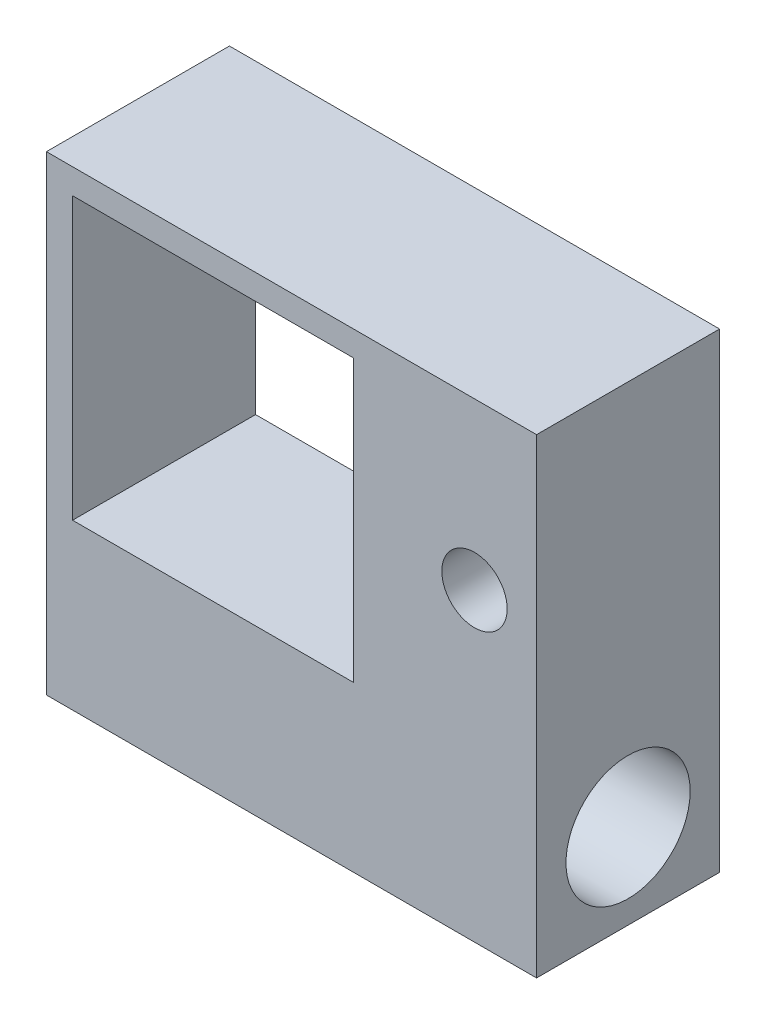
ISO-10303-21;
HEADER;
FILE_DESCRIPTION(('STEP AP214'),'2;1');
FILE_NAME('part.step','',(''),(''),'','','');
FILE_SCHEMA(('AUTOMOTIVE_DESIGN { 1 0 10303 214 1 1 1 1 }'));
ENDSEC;
DATA;
#1=APPLICATION_CONTEXT('core data for automotive mechanical design processes');
#2=APPLICATION_PROTOCOL_DEFINITION('international standard','automotive_design',2000,#1);
#3=PRODUCT_CONTEXT('',#1,'mechanical');
#4=PRODUCT('Part','Part','',(#3));
#5=PRODUCT_RELATED_PRODUCT_CATEGORY('part','',(#4));
#6=PRODUCT_DEFINITION_FORMATION('','',#4);
#7=PRODUCT_DEFINITION_CONTEXT('part definition',#1,'design');
#8=PRODUCT_DEFINITION('design','',#6,#7);
#9=PRODUCT_DEFINITION_SHAPE('','',#8);
#10=(LENGTH_UNIT() NAMED_UNIT(*) SI_UNIT(.MILLI.,.METRE.));
#11=(NAMED_UNIT(*) PLANE_ANGLE_UNIT() SI_UNIT($,.RADIAN.));
#12=(NAMED_UNIT(*) SI_UNIT($,.STERADIAN.) SOLID_ANGLE_UNIT());
#13=UNCERTAINTY_MEASURE_WITH_UNIT(LENGTH_MEASURE(1.E-05),#10,'distance_accuracy_value','');
#14=(GEOMETRIC_REPRESENTATION_CONTEXT(3) GLOBAL_UNCERTAINTY_ASSIGNED_CONTEXT((#13)) GLOBAL_UNIT_ASSIGNED_CONTEXT((#10,
#11,#12)) REPRESENTATION_CONTEXT('',''));
#15=CARTESIAN_POINT('',(0.,0.,0.));
#16=DIRECTION('',(0.,0.,1.));
#17=DIRECTION('',(1.,0.,0.));
#18=AXIS2_PLACEMENT_3D('',#15,#16,#17);
#19=CARTESIAN_POINT('',(0.,0.,28.));
#20=DIRECTION('',(0.,0.,-1.));
#21=DIRECTION('',(-1.,0.,0.));
#22=AXIS2_PLACEMENT_3D('',#19,#20,#21);
#23=PLANE('',#22);
#24=DIRECTION('',(0.,1.,0.));
#25=VECTOR('',#24,1.);
#26=CARTESIAN_POINT('',(37.5,-36.,28.));
#27=LINE('',#26,#25);
#28=CARTESIAN_POINT('',(37.5,-36.,28.));
#29=VERTEX_POINT('',#28);
#30=CARTESIAN_POINT('',(37.5,36.,28.));
#31=VERTEX_POINT('',#30);
#32=EDGE_CURVE('E156',#29,#31,#27,.T.);
#33=ORIENTED_EDGE('',*,*,#32,.T.);
#34=DIRECTION('',(-1.,0.,0.));
#35=VECTOR('',#34,1.);
#36=CARTESIAN_POINT('',(-37.5,36.,28.));
#37=LINE('',#36,#35);
#38=CARTESIAN_POINT('',(-37.5,36.,28.));
#39=VERTEX_POINT('',#38);
#40=EDGE_CURVE('E160',#31,#39,#37,.T.);
#41=ORIENTED_EDGE('',*,*,#40,.T.);
#42=DIRECTION('',(0.,-1.,0.));
#43=VECTOR('',#42,1.);
#44=CARTESIAN_POINT('',(-37.5,-36.,28.));
#45=LINE('',#44,#43);
#46=CARTESIAN_POINT('',(-37.5,-36.,28.));
#47=VERTEX_POINT('',#46);
#48=EDGE_CURVE('E164',#39,#47,#45,.T.);
#49=ORIENTED_EDGE('',*,*,#48,.T.);
#50=DIRECTION('',(1.,0.,0.));
#51=VECTOR('',#50,1.);
#52=CARTESIAN_POINT('',(-37.5,-36.,28.));
#53=LINE('',#52,#51);
#54=EDGE_CURVE('E167',#47,#29,#53,.T.);
#55=ORIENTED_EDGE('',*,*,#54,.T.);
#56=EDGE_LOOP('',(#33,#41,#49,#55));
#57=FACE_BOUND('',#56,.T.);
#58=DIRECTION('',(0.,-1.,0.));
#59=VECTOR('',#58,1.);
#60=CARTESIAN_POINT('',(-33.5,32.16,28.));
#61=LINE('',#60,#59);
#62=CARTESIAN_POINT('',(-33.5,32.16,28.));
#63=VERTEX_POINT('',#62);
#64=CARTESIAN_POINT('',(-33.5,-10.84,28.));
#65=VERTEX_POINT('',#64);
#66=EDGE_CURVE('E105',#63,#65,#61,.T.);
#67=ORIENTED_EDGE('',*,*,#66,.F.);
#68=DIRECTION('',(-1.,0.,0.));
#69=VECTOR('',#68,1.);
#70=CARTESIAN_POINT('',(-33.5,32.16,28.));
#71=LINE('',#70,#69);
#72=CARTESIAN_POINT('',(9.49999999999998,32.16,28.));
#73=VERTEX_POINT('',#72);
#74=EDGE_CURVE('E132',#73,#63,#71,.T.);
#75=ORIENTED_EDGE('',*,*,#74,.F.);
#76=DIRECTION('',(0.,1.,0.));
#77=VECTOR('',#76,1.);
#78=CARTESIAN_POINT('',(9.49999999999998,32.16,28.));
#79=LINE('',#78,#77);
#80=CARTESIAN_POINT('',(9.49999999999999,-10.84,28.));
#81=VERTEX_POINT('',#80);
#82=EDGE_CURVE('E128',#81,#73,#79,.T.);
#83=ORIENTED_EDGE('',*,*,#82,.F.);
#84=DIRECTION('',(1.,0.,0.));
#85=VECTOR('',#84,1.);
#86=CARTESIAN_POINT('',(-33.5,-10.84,28.));
#87=LINE('',#86,#85);
#88=EDGE_CURVE('E114',#65,#81,#87,.T.);
#89=ORIENTED_EDGE('',*,*,#88,.F.);
#90=EDGE_LOOP('',(#67,#75,#83,#89));
#91=FACE_BOUND('',#90,.T.);
#92=CARTESIAN_POINT('',(28.,10.66,28.));
#93=DIRECTION('',(0.,0.,1.));
#94=DIRECTION('',(1.,0.,0.));
#95=AXIS2_PLACEMENT_3D('',#92,#93,#94);
#96=CIRCLE('',#95,5.00000000000001);
#97=CARTESIAN_POINT('',(33.,10.66,28.));
#98=VERTEX_POINT('',#97);
#99=EDGE_CURVE('E140',#98,#98,#96,.T.);
#100=ORIENTED_EDGE('',*,*,#99,.F.);
#101=EDGE_LOOP('',(#100));
#102=FACE_BOUND('',#101,.T.);
#103=ADVANCED_FACE('F39',(#57,#91,#102),#23,.F.);
#104=CARTESIAN_POINT('',(0.,0.,0.));
#105=DIRECTION('',(0.,0.,-1.));
#106=DIRECTION('',(-1.,0.,0.));
#107=AXIS2_PLACEMENT_3D('',#104,#105,#106);
#108=PLANE('',#107);
#109=DIRECTION('',(-1.,0.,0.));
#110=VECTOR('',#109,1.);
#111=CARTESIAN_POINT('',(-33.5,32.16,0.));
#112=LINE('',#111,#110);
#113=CARTESIAN_POINT('',(9.49999999999998,32.16,0.));
#114=VERTEX_POINT('',#113);
#115=CARTESIAN_POINT('',(-33.5,32.16,0.));
#116=VERTEX_POINT('',#115);
#117=EDGE_CURVE('E115',#114,#116,#112,.T.);
#118=ORIENTED_EDGE('',*,*,#117,.T.);
#119=DIRECTION('',(0.,-1.,0.));
#120=VECTOR('',#119,1.);
#121=CARTESIAN_POINT('',(-33.5,32.16,0.));
#122=LINE('',#121,#120);
#123=CARTESIAN_POINT('',(-33.5,-10.84,0.));
#124=VERTEX_POINT('',#123);
#125=EDGE_CURVE('E63',#116,#124,#122,.T.);
#126=ORIENTED_EDGE('',*,*,#125,.T.);
#127=DIRECTION('',(1.,0.,0.));
#128=VECTOR('',#127,1.);
#129=CARTESIAN_POINT('',(-33.5,-10.84,0.));
#130=LINE('',#129,#128);
#131=CARTESIAN_POINT('',(9.49999999999999,-10.84,0.));
#132=VERTEX_POINT('',#131);
#133=EDGE_CURVE('E121',#124,#132,#130,.T.);
#134=ORIENTED_EDGE('',*,*,#133,.T.);
#135=DIRECTION('',(0.,1.,0.));
#136=VECTOR('',#135,1.);
#137=CARTESIAN_POINT('',(9.49999999999998,32.16,0.));
#138=LINE('',#137,#136);
#139=EDGE_CURVE('E143',#132,#114,#138,.T.);
#140=ORIENTED_EDGE('',*,*,#139,.T.);
#141=EDGE_LOOP('',(#118,#126,#134,#140));
#142=FACE_BOUND('',#141,.T.);
#143=DIRECTION('',(0.,1.,0.));
#144=VECTOR('',#143,1.);
#145=CARTESIAN_POINT('',(37.5,-36.,0.));
#146=LINE('',#145,#144);
#147=CARTESIAN_POINT('',(37.5,-36.,0.));
#148=VERTEX_POINT('',#147);
#149=CARTESIAN_POINT('',(37.5,36.,0.));
#150=VERTEX_POINT('',#149);
#151=EDGE_CURVE('E123',#148,#150,#146,.T.);
#152=ORIENTED_EDGE('',*,*,#151,.F.);
#153=DIRECTION('',(1.,0.,0.));
#154=VECTOR('',#153,1.);
#155=CARTESIAN_POINT('',(-37.5,-36.,0.));
#156=LINE('',#155,#154);
#157=CARTESIAN_POINT('',(-37.5,-36.,0.));
#158=VERTEX_POINT('',#157);
#159=EDGE_CURVE('E161',#158,#148,#156,.T.);
#160=ORIENTED_EDGE('',*,*,#159,.F.);
#161=DIRECTION('',(0.,-1.,0.));
#162=VECTOR('',#161,1.);
#163=CARTESIAN_POINT('',(-37.5,-36.,0.));
#164=LINE('',#163,#162);
#165=CARTESIAN_POINT('',(-37.5,36.,0.));
#166=VERTEX_POINT('',#165);
#167=EDGE_CURVE('E177',#166,#158,#164,.T.);
#168=ORIENTED_EDGE('',*,*,#167,.F.);
#169=DIRECTION('',(-1.,0.,0.));
#170=VECTOR('',#169,1.);
#171=CARTESIAN_POINT('',(-37.5,36.,0.));
#172=LINE('',#171,#170);
#173=EDGE_CURVE('E174',#150,#166,#172,.T.);
#174=ORIENTED_EDGE('',*,*,#173,.F.);
#175=EDGE_LOOP('',(#152,#160,#168,#174));
#176=FACE_BOUND('',#175,.T.);
#177=CARTESIAN_POINT('',(28.,10.66,0.));
#178=DIRECTION('',(0.,0.,1.));
#179=DIRECTION('',(1.,0.,0.));
#180=AXIS2_PLACEMENT_3D('',#177,#178,#179);
#181=CIRCLE('',#180,5.00000000000001);
#182=CARTESIAN_POINT('',(33.,10.66,0.));
#183=VERTEX_POINT('',#182);
#184=EDGE_CURVE('E265',#183,#183,#181,.T.);
#185=ORIENTED_EDGE('',*,*,#184,.T.);
#186=EDGE_LOOP('',(#185));
#187=FACE_BOUND('',#186,.T.);
#188=ADVANCED_FACE('F200',(#142,#176,#187),#108,.T.);
#189=CARTESIAN_POINT('',(37.5,-36.,28.));
#190=DIRECTION('',(-1.,0.,0.));
#191=DIRECTION('',(0.,-1.,0.));
#192=AXIS2_PLACEMENT_3D('',#189,#190,#191);
#193=PLANE('',#192);
#194=CARTESIAN_POINT('',(37.5,-23.,14.));
#195=DIRECTION('',(1.,0.,0.));
#196=DIRECTION('',(0.,0.,-1.));
#197=AXIS2_PLACEMENT_3D('',#194,#195,#196);
#198=CIRCLE('',#197,9.5);
#199=CARTESIAN_POINT('',(37.5,-23.,4.5));
#200=VERTEX_POINT('',#199);
#201=EDGE_CURVE('E261',#200,#200,#198,.T.);
#202=ORIENTED_EDGE('',*,*,#201,.F.);
#203=EDGE_LOOP('',(#202));
#204=FACE_BOUND('',#203,.T.);
#205=ORIENTED_EDGE('',*,*,#151,.T.);
#206=DIRECTION('',(0.,0.,-1.));
#207=VECTOR('',#206,1.);
#208=CARTESIAN_POINT('',(37.5,36.,28.));
#209=LINE('',#208,#207);
#210=EDGE_CURVE('E11',#31,#150,#209,.T.);
#211=ORIENTED_EDGE('',*,*,#210,.F.);
#212=ORIENTED_EDGE('',*,*,#32,.F.);
#213=DIRECTION('',(0.,0.,-1.));
#214=VECTOR('',#213,1.);
#215=CARTESIAN_POINT('',(37.5,-36.,28.));
#216=LINE('',#215,#214);
#217=EDGE_CURVE('E170',#29,#148,#216,.T.);
#218=ORIENTED_EDGE('',*,*,#217,.T.);
#219=EDGE_LOOP('',(#205,#211,#212,#218));
#220=FACE_BOUND('',#219,.T.);
#221=ADVANCED_FACE('F41',(#204,#220),#193,.F.);
#222=CARTESIAN_POINT('',(-37.5,36.,28.));
#223=DIRECTION('',(0.,-1.,0.));
#224=DIRECTION('',(0.,0.,-1.));
#225=AXIS2_PLACEMENT_3D('',#222,#223,#224);
#226=PLANE('',#225);
#227=ORIENTED_EDGE('',*,*,#173,.T.);
#228=DIRECTION('',(0.,0.,-1.));
#229=VECTOR('',#228,1.);
#230=CARTESIAN_POINT('',(-37.5,36.,28.));
#231=LINE('',#230,#229);
#232=EDGE_CURVE('E48',#39,#166,#231,.T.);
#233=ORIENTED_EDGE('',*,*,#232,.F.);
#234=ORIENTED_EDGE('',*,*,#40,.F.);
#235=ORIENTED_EDGE('',*,*,#210,.T.);
#236=EDGE_LOOP('',(#227,#233,#234,#235));
#237=FACE_BOUND('',#236,.T.);
#238=ADVANCED_FACE('F210',(#237),#226,.F.);
#239=CARTESIAN_POINT('',(-37.5,-36.,28.));
#240=DIRECTION('',(1.,0.,0.));
#241=DIRECTION('',(0.,1.,0.));
#242=AXIS2_PLACEMENT_3D('',#239,#240,#241);
#243=PLANE('',#242);
#244=CARTESIAN_POINT('',(-37.5,-23.,14.));
#245=DIRECTION('',(1.,0.,0.));
#246=DIRECTION('',(0.,0.,-1.));
#247=AXIS2_PLACEMENT_3D('',#244,#245,#246);
#248=CIRCLE('',#247,9.5);
#249=CARTESIAN_POINT('',(-37.5,-23.,4.5));
#250=VERTEX_POINT('',#249);
#251=EDGE_CURVE('E258',#250,#250,#248,.T.);
#252=ORIENTED_EDGE('',*,*,#251,.T.);
#253=EDGE_LOOP('',(#252));
#254=FACE_BOUND('',#253,.T.);
#255=ORIENTED_EDGE('',*,*,#167,.T.);
#256=DIRECTION('',(0.,0.,-1.));
#257=VECTOR('',#256,1.);
#258=CARTESIAN_POINT('',(-37.5,-36.,28.));
#259=LINE('',#258,#257);
#260=EDGE_CURVE('E185',#47,#158,#259,.T.);
#261=ORIENTED_EDGE('',*,*,#260,.F.);
#262=ORIENTED_EDGE('',*,*,#48,.F.);
#263=ORIENTED_EDGE('',*,*,#232,.T.);
#264=EDGE_LOOP('',(#255,#261,#262,#263));
#265=FACE_BOUND('',#264,.T.);
#266=ADVANCED_FACE('F194',(#254,#265),#243,.F.);
#267=CARTESIAN_POINT('',(-37.5,-36.,28.));
#268=DIRECTION('',(0.,1.,0.));
#269=DIRECTION('',(0.,0.,1.));
#270=AXIS2_PLACEMENT_3D('',#267,#268,#269);
#271=PLANE('',#270);
#272=ORIENTED_EDGE('',*,*,#159,.T.);
#273=ORIENTED_EDGE('',*,*,#217,.F.);
#274=ORIENTED_EDGE('',*,*,#54,.F.);
#275=ORIENTED_EDGE('',*,*,#260,.T.);
#276=EDGE_LOOP('',(#272,#273,#274,#275));
#277=FACE_BOUND('',#276,.T.);
#278=ADVANCED_FACE('F204',(#277),#271,.F.);
#279=CARTESIAN_POINT('',(-33.5,32.16,28.));
#280=DIRECTION('',(1.,0.,0.));
#281=DIRECTION('',(0.,1.,0.));
#282=AXIS2_PLACEMENT_3D('',#279,#280,#281);
#283=PLANE('',#282);
#284=ORIENTED_EDGE('',*,*,#125,.F.);
#285=DIRECTION('',(0.,0.,-1.));
#286=VECTOR('',#285,1.);
#287=CARTESIAN_POINT('',(-33.5,32.16,28.));
#288=LINE('',#287,#286);
#289=EDGE_CURVE('E109',#63,#116,#288,.T.);
#290=ORIENTED_EDGE('',*,*,#289,.F.);
#291=ORIENTED_EDGE('',*,*,#66,.T.);
#292=DIRECTION('',(0.,0.,-1.));
#293=VECTOR('',#292,1.);
#294=CARTESIAN_POINT('',(-33.5,-10.84,28.));
#295=LINE('',#294,#293);
#296=EDGE_CURVE('E108',#65,#124,#295,.T.);
#297=ORIENTED_EDGE('',*,*,#296,.T.);
#298=EDGE_LOOP('',(#284,#290,#291,#297));
#299=FACE_BOUND('',#298,.T.);
#300=ADVANCED_FACE('F107',(#299),#283,.T.);
#301=CARTESIAN_POINT('',(-33.5,-10.84,28.));
#302=DIRECTION('',(0.,1.,0.));
#303=DIRECTION('',(0.,0.,1.));
#304=AXIS2_PLACEMENT_3D('',#301,#302,#303);
#305=PLANE('',#304);
#306=ORIENTED_EDGE('',*,*,#133,.F.);
#307=ORIENTED_EDGE('',*,*,#296,.F.);
#308=ORIENTED_EDGE('',*,*,#88,.T.);
#309=DIRECTION('',(0.,0.,-1.));
#310=VECTOR('',#309,1.);
#311=CARTESIAN_POINT('',(9.49999999999999,-10.84,28.));
#312=LINE('',#311,#310);
#313=EDGE_CURVE('E124',#81,#132,#312,.T.);
#314=ORIENTED_EDGE('',*,*,#313,.T.);
#315=EDGE_LOOP('',(#306,#307,#308,#314));
#316=FACE_BOUND('',#315,.T.);
#317=ADVANCED_FACE('F118',(#316),#305,.T.);
#318=CARTESIAN_POINT('',(9.49999999999998,32.16,28.));
#319=DIRECTION('',(-1.,0.,0.));
#320=DIRECTION('',(0.,-1.,0.));
#321=AXIS2_PLACEMENT_3D('',#318,#319,#320);
#322=PLANE('',#321);
#323=ORIENTED_EDGE('',*,*,#139,.F.);
#324=ORIENTED_EDGE('',*,*,#313,.F.);
#325=ORIENTED_EDGE('',*,*,#82,.T.);
#326=DIRECTION('',(0.,0.,-1.));
#327=VECTOR('',#326,1.);
#328=CARTESIAN_POINT('',(9.49999999999998,32.16,28.));
#329=LINE('',#328,#327);
#330=EDGE_CURVE('E55',#73,#114,#329,.T.);
#331=ORIENTED_EDGE('',*,*,#330,.T.);
#332=EDGE_LOOP('',(#323,#324,#325,#331));
#333=FACE_BOUND('',#332,.T.);
#334=ADVANCED_FACE('F236',(#333),#322,.T.);
#335=CARTESIAN_POINT('',(-33.5,32.16,28.));
#336=DIRECTION('',(0.,-1.,0.));
#337=DIRECTION('',(0.,0.,-1.));
#338=AXIS2_PLACEMENT_3D('',#335,#336,#337);
#339=PLANE('',#338);
#340=ORIENTED_EDGE('',*,*,#117,.F.);
#341=ORIENTED_EDGE('',*,*,#330,.F.);
#342=ORIENTED_EDGE('',*,*,#74,.T.);
#343=ORIENTED_EDGE('',*,*,#289,.T.);
#344=EDGE_LOOP('',(#340,#341,#342,#343));
#345=FACE_BOUND('',#344,.T.);
#346=ADVANCED_FACE('F240',(#345),#339,.T.);
#347=CARTESIAN_POINT('',(28.,10.66,28.));
#348=DIRECTION('',(0.,0.,-1.));
#349=DIRECTION('',(-1.,0.,0.));
#350=AXIS2_PLACEMENT_3D('',#347,#348,#349);
#351=CYLINDRICAL_SURFACE('',#350,5.00000000000001);
#352=ORIENTED_EDGE('',*,*,#99,.T.);
#353=EDGE_LOOP('',(#352));
#354=FACE_BOUND('',#353,.T.);
#355=ORIENTED_EDGE('',*,*,#184,.F.);
#356=EDGE_LOOP('',(#355));
#357=FACE_BOUND('',#356,.T.);
#358=ADVANCED_FACE('F246',(#354,#357),#351,.F.);
#359=CARTESIAN_POINT('',(-37.5,-23.,14.));
#360=DIRECTION('',(1.,0.,0.));
#361=DIRECTION('',(0.,0.,-1.));
#362=AXIS2_PLACEMENT_3D('',#359,#360,#361);
#363=CYLINDRICAL_SURFACE('',#362,9.5);
#364=ORIENTED_EDGE('',*,*,#251,.F.);
#365=EDGE_LOOP('',(#364));
#366=FACE_BOUND('',#365,.T.);
#367=ORIENTED_EDGE('',*,*,#201,.T.);
#368=EDGE_LOOP('',(#367));
#369=FACE_BOUND('',#368,.T.);
#370=ADVANCED_FACE('F249',(#366,#369),#363,.F.);
#371=CLOSED_SHELL('',(#103,#188,#221,#238,#266,#278,#300,#317,#334,#346,#358,#370));
#372=MANIFOLD_SOLID_BREP('B2',#371);
#373=ADVANCED_BREP_SHAPE_REPRESENTATION('',(#18,#372),#14);
#374=SHAPE_DEFINITION_REPRESENTATION(#9,#373);
ENDSEC;
END-ISO-10303-21;
